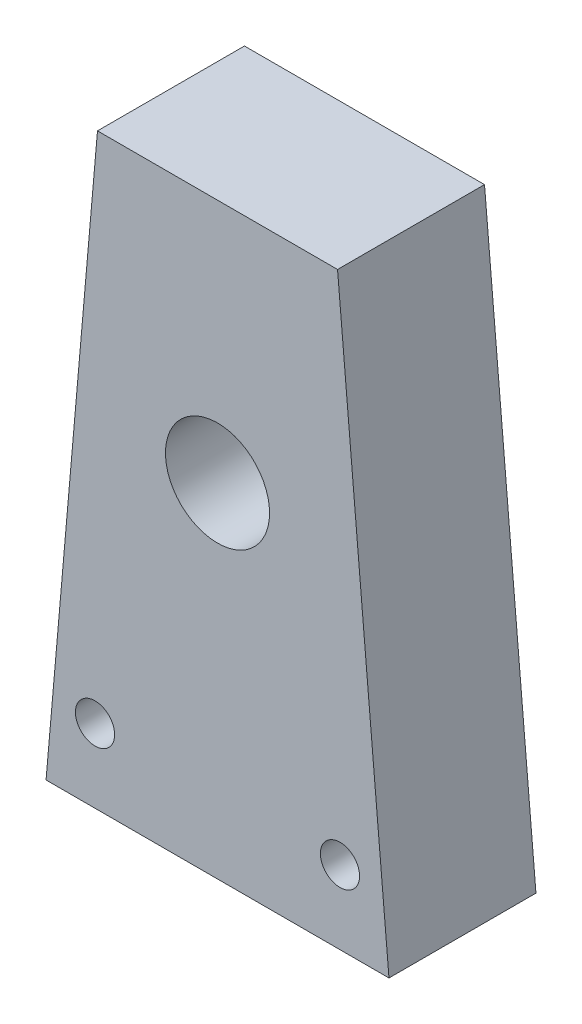
ISO-10303-21;
HEADER;
FILE_DESCRIPTION(('STEP AP214'),'2;1');
FILE_NAME('part.step','',(''),(''),'','','');
FILE_SCHEMA(('AUTOMOTIVE_DESIGN { 1 0 10303 214 1 1 1 1 }'));
ENDSEC;
DATA;
#1=APPLICATION_CONTEXT('core data for automotive mechanical design processes');
#2=APPLICATION_PROTOCOL_DEFINITION('international standard','automotive_design',2000,#1);
#3=PRODUCT_CONTEXT('',#1,'mechanical');
#4=PRODUCT('Part','Part','',(#3));
#5=PRODUCT_RELATED_PRODUCT_CATEGORY('part','',(#4));
#6=PRODUCT_DEFINITION_FORMATION('','',#4);
#7=PRODUCT_DEFINITION_CONTEXT('part definition',#1,'design');
#8=PRODUCT_DEFINITION('design','',#6,#7);
#9=PRODUCT_DEFINITION_SHAPE('','',#8);
#10=(LENGTH_UNIT() NAMED_UNIT(*) SI_UNIT(.MILLI.,.METRE.));
#11=(NAMED_UNIT(*) PLANE_ANGLE_UNIT() SI_UNIT($,.RADIAN.));
#12=(NAMED_UNIT(*) SI_UNIT($,.STERADIAN.) SOLID_ANGLE_UNIT());
#13=UNCERTAINTY_MEASURE_WITH_UNIT(LENGTH_MEASURE(1.E-05),#10,'distance_accuracy_value','');
#14=(GEOMETRIC_REPRESENTATION_CONTEXT(3) GLOBAL_UNCERTAINTY_ASSIGNED_CONTEXT((#13)) GLOBAL_UNIT_ASSIGNED_CONTEXT((#10,
#11,#12)) REPRESENTATION_CONTEXT('',''));
#15=CARTESIAN_POINT('',(0.,0.,0.));
#16=DIRECTION('',(0.,0.,1.));
#17=DIRECTION('',(1.,0.,0.));
#18=AXIS2_PLACEMENT_3D('',#15,#16,#17);
#19=CARTESIAN_POINT('',(-9.8,48.,12.));
#20=DIRECTION('',(0.996193717496113,-0.0871669502809099,0.));
#21=DIRECTION('',(0.0871669502809099,0.996193717496113,0.));
#22=AXIS2_PLACEMENT_3D('',#19,#20,#21);
#23=PLANE('',#22);
#24=DIRECTION('',(-0.0871669502809099,-0.996193717496113,0.));
#25=VECTOR('',#24,1.);
#26=CARTESIAN_POINT('',(-9.8,48.,0.));
#27=LINE('',#26,#25);
#28=CARTESIAN_POINT('',(-9.8,48.,0.));
#29=VERTEX_POINT('',#28);
#30=CARTESIAN_POINT('',(-14.,0.,0.));
#31=VERTEX_POINT('',#30);
#32=EDGE_CURVE('E114',#29,#31,#27,.T.);
#33=ORIENTED_EDGE('',*,*,#32,.T.);
#34=DIRECTION('',(0.,0.,-1.));
#35=VECTOR('',#34,1.);
#36=CARTESIAN_POINT('',(-14.,0.,12.));
#37=LINE('',#36,#35);
#38=CARTESIAN_POINT('',(-14.,0.,12.));
#39=VERTEX_POINT('',#38);
#40=EDGE_CURVE('E11',#39,#31,#37,.T.);
#41=ORIENTED_EDGE('',*,*,#40,.F.);
#42=DIRECTION('',(-0.0871669502809099,-0.996193717496113,0.));
#43=VECTOR('',#42,1.);
#44=CARTESIAN_POINT('',(-9.8,48.,12.));
#45=LINE('',#44,#43);
#46=CARTESIAN_POINT('',(-9.8,48.,12.));
#47=VERTEX_POINT('',#46);
#48=EDGE_CURVE('E100',#47,#39,#45,.T.);
#49=ORIENTED_EDGE('',*,*,#48,.F.);
#50=DIRECTION('',(0.,0.,-1.));
#51=VECTOR('',#50,1.);
#52=CARTESIAN_POINT('',(-9.8,48.,12.));
#53=LINE('',#52,#51);
#54=EDGE_CURVE('E108',#47,#29,#53,.T.);
#55=ORIENTED_EDGE('',*,*,#54,.T.);
#56=EDGE_LOOP('',(#33,#41,#49,#55));
#57=FACE_BOUND('',#56,.T.);
#58=ADVANCED_FACE('F44',(#57),#23,.F.);
#59=CARTESIAN_POINT('',(-14.,0.,12.));
#60=DIRECTION('',(0.,1.,0.));
#61=DIRECTION('',(0.,0.,1.));
#62=AXIS2_PLACEMENT_3D('',#59,#60,#61);
#63=PLANE('',#62);
#64=DIRECTION('',(1.,0.,0.));
#65=VECTOR('',#64,1.);
#66=CARTESIAN_POINT('',(-14.,0.,0.));
#67=LINE('',#66,#65);
#68=CARTESIAN_POINT('',(14.,0.,0.));
#69=VERTEX_POINT('',#68);
#70=EDGE_CURVE('E105',#31,#69,#67,.T.);
#71=ORIENTED_EDGE('',*,*,#70,.T.);
#72=DIRECTION('',(0.,0.,-1.));
#73=VECTOR('',#72,1.);
#74=CARTESIAN_POINT('',(14.,0.,12.));
#75=LINE('',#74,#73);
#76=CARTESIAN_POINT('',(14.,0.,12.));
#77=VERTEX_POINT('',#76);
#78=EDGE_CURVE('E53',#77,#69,#75,.T.);
#79=ORIENTED_EDGE('',*,*,#78,.F.);
#80=DIRECTION('',(1.,0.,0.));
#81=VECTOR('',#80,1.);
#82=CARTESIAN_POINT('',(-14.,0.,12.));
#83=LINE('',#82,#81);
#84=EDGE_CURVE('E95',#39,#77,#83,.T.);
#85=ORIENTED_EDGE('',*,*,#84,.F.);
#86=ORIENTED_EDGE('',*,*,#40,.T.);
#87=EDGE_LOOP('',(#71,#79,#85,#86));
#88=FACE_BOUND('',#87,.T.);
#89=ADVANCED_FACE('F101',(#88),#63,.F.);
#90=CARTESIAN_POINT('',(14.,0.,12.));
#91=DIRECTION('',(-0.996193717496113,-0.0871669502809099,0.));
#92=DIRECTION('',(0.0871669502809099,-0.996193717496113,0.));
#93=AXIS2_PLACEMENT_3D('',#90,#91,#92);
#94=PLANE('',#93);
#95=DIRECTION('',(-0.0871669502809099,0.996193717496113,0.));
#96=VECTOR('',#95,1.);
#97=CARTESIAN_POINT('',(14.,0.,0.));
#98=LINE('',#97,#96);
#99=CARTESIAN_POINT('',(9.8,48.,0.));
#100=VERTEX_POINT('',#99);
#101=EDGE_CURVE('E76',#69,#100,#98,.T.);
#102=ORIENTED_EDGE('',*,*,#101,.T.);
#103=DIRECTION('',(0.,0.,-1.));
#104=VECTOR('',#103,1.);
#105=CARTESIAN_POINT('',(9.8,48.,12.));
#106=LINE('',#105,#104);
#107=CARTESIAN_POINT('',(9.8,48.,12.));
#108=VERTEX_POINT('',#107);
#109=EDGE_CURVE('E102',#108,#100,#106,.T.);
#110=ORIENTED_EDGE('',*,*,#109,.F.);
#111=DIRECTION('',(-0.0871669502809099,0.996193717496113,0.));
#112=VECTOR('',#111,1.);
#113=CARTESIAN_POINT('',(14.,0.,12.));
#114=LINE('',#113,#112);
#115=EDGE_CURVE('E92',#77,#108,#114,.T.);
#116=ORIENTED_EDGE('',*,*,#115,.F.);
#117=ORIENTED_EDGE('',*,*,#78,.T.);
#118=EDGE_LOOP('',(#102,#110,#116,#117));
#119=FACE_BOUND('',#118,.T.);
#120=ADVANCED_FACE('F104',(#119),#94,.F.);
#121=CARTESIAN_POINT('',(9.8,48.,12.));
#122=DIRECTION('',(0.,-1.,0.));
#123=DIRECTION('',(0.,0.,-1.));
#124=AXIS2_PLACEMENT_3D('',#121,#122,#123);
#125=PLANE('',#124);
#126=DIRECTION('',(-1.,0.,0.));
#127=VECTOR('',#126,1.);
#128=CARTESIAN_POINT('',(9.8,48.,0.));
#129=LINE('',#128,#127);
#130=EDGE_CURVE('E82',#100,#29,#129,.T.);
#131=ORIENTED_EDGE('',*,*,#130,.T.);
#132=ORIENTED_EDGE('',*,*,#54,.F.);
#133=DIRECTION('',(-1.,0.,0.));
#134=VECTOR('',#133,1.);
#135=CARTESIAN_POINT('',(9.8,48.,12.));
#136=LINE('',#135,#134);
#137=EDGE_CURVE('E65',#108,#47,#136,.T.);
#138=ORIENTED_EDGE('',*,*,#137,.F.);
#139=ORIENTED_EDGE('',*,*,#109,.T.);
#140=EDGE_LOOP('',(#131,#132,#138,#139));
#141=FACE_BOUND('',#140,.T.);
#142=ADVANCED_FACE('F130',(#141),#125,.F.);
#143=CARTESIAN_POINT('',(0.,0.,12.));
#144=DIRECTION('',(0.,0.,1.));
#145=DIRECTION('',(1.,0.,0.));
#146=AXIS2_PLACEMENT_3D('',#143,#144,#145);
#147=PLANE('',#146);
#148=CARTESIAN_POINT('',(0.,28.,12.));
#149=DIRECTION('',(0.,0.,1.));
#150=DIRECTION('',(1.,0.,0.));
#151=AXIS2_PLACEMENT_3D('',#148,#149,#150);
#152=CIRCLE('',#151,4.25);
#153=CARTESIAN_POINT('',(4.25,28.,12.));
#154=VERTEX_POINT('',#153);
#155=EDGE_CURVE('E120',#154,#154,#152,.F.);
#156=ORIENTED_EDGE('',*,*,#155,.T.);
#157=EDGE_LOOP('',(#156));
#158=FACE_BOUND('',#157,.T.);
#159=CARTESIAN_POINT('',(10.,6.,12.));
#160=DIRECTION('',(0.,0.,1.));
#161=DIRECTION('',(1.,0.,0.));
#162=AXIS2_PLACEMENT_3D('',#159,#160,#161);
#163=CIRCLE('',#162,1.6);
#164=CARTESIAN_POINT('',(11.6,6.,12.));
#165=VERTEX_POINT('',#164);
#166=EDGE_CURVE('E136',#165,#165,#163,.F.);
#167=ORIENTED_EDGE('',*,*,#166,.T.);
#168=EDGE_LOOP('',(#167));
#169=FACE_BOUND('',#168,.T.);
#170=CARTESIAN_POINT('',(-10.,6.,12.));
#171=DIRECTION('',(0.,0.,1.));
#172=DIRECTION('',(1.,0.,0.));
#173=AXIS2_PLACEMENT_3D('',#170,#171,#172);
#174=CIRCLE('',#173,1.6);
#175=CARTESIAN_POINT('',(-8.4,6.,12.));
#176=VERTEX_POINT('',#175);
#177=EDGE_CURVE('E143',#176,#176,#174,.F.);
#178=ORIENTED_EDGE('',*,*,#177,.T.);
#179=EDGE_LOOP('',(#178));
#180=FACE_BOUND('',#179,.T.);
#181=ORIENTED_EDGE('',*,*,#48,.T.);
#182=ORIENTED_EDGE('',*,*,#84,.T.);
#183=ORIENTED_EDGE('',*,*,#115,.T.);
#184=ORIENTED_EDGE('',*,*,#137,.T.);
#185=EDGE_LOOP('',(#181,#182,#183,#184));
#186=FACE_BOUND('',#185,.T.);
#187=ADVANCED_FACE('F91',(#158,#169,#180,#186),#147,.T.);
#188=CARTESIAN_POINT('',(0.,0.,0.));
#189=DIRECTION('',(0.,0.,1.));
#190=DIRECTION('',(1.,0.,0.));
#191=AXIS2_PLACEMENT_3D('',#188,#189,#190);
#192=PLANE('',#191);
#193=CARTESIAN_POINT('',(0.,28.,0.));
#194=DIRECTION('',(0.,0.,1.));
#195=DIRECTION('',(1.,0.,0.));
#196=AXIS2_PLACEMENT_3D('',#193,#194,#195);
#197=CIRCLE('',#196,4.25);
#198=CARTESIAN_POINT('',(4.25,28.,0.));
#199=VERTEX_POINT('',#198);
#200=EDGE_CURVE('E144',#199,#199,#197,.T.);
#201=ORIENTED_EDGE('',*,*,#200,.T.);
#202=EDGE_LOOP('',(#201));
#203=FACE_BOUND('',#202,.T.);
#204=CARTESIAN_POINT('',(10.,6.,0.));
#205=DIRECTION('',(0.,0.,1.));
#206=DIRECTION('',(1.,0.,0.));
#207=AXIS2_PLACEMENT_3D('',#204,#205,#206);
#208=CIRCLE('',#207,1.6);
#209=CARTESIAN_POINT('',(11.6,6.,0.));
#210=VERTEX_POINT('',#209);
#211=EDGE_CURVE('E147',#210,#210,#208,.T.);
#212=ORIENTED_EDGE('',*,*,#211,.T.);
#213=EDGE_LOOP('',(#212));
#214=FACE_BOUND('',#213,.T.);
#215=CARTESIAN_POINT('',(-10.,6.,0.));
#216=DIRECTION('',(0.,0.,1.));
#217=DIRECTION('',(1.,0.,0.));
#218=AXIS2_PLACEMENT_3D('',#215,#216,#217);
#219=CIRCLE('',#218,1.6);
#220=CARTESIAN_POINT('',(-8.4,6.,0.));
#221=VERTEX_POINT('',#220);
#222=EDGE_CURVE('E148',#221,#221,#219,.T.);
#223=ORIENTED_EDGE('',*,*,#222,.T.);
#224=EDGE_LOOP('',(#223));
#225=FACE_BOUND('',#224,.T.);
#226=ORIENTED_EDGE('',*,*,#32,.F.);
#227=ORIENTED_EDGE('',*,*,#130,.F.);
#228=ORIENTED_EDGE('',*,*,#101,.F.);
#229=ORIENTED_EDGE('',*,*,#70,.F.);
#230=EDGE_LOOP('',(#226,#227,#228,#229));
#231=FACE_BOUND('',#230,.T.);
#232=ADVANCED_FACE('F128',(#203,#214,#225,#231),#192,.F.);
#233=CARTESIAN_POINT('',(-10.,6.,13.));
#234=DIRECTION('',(0.,0.,-1.));
#235=DIRECTION('',(-1.,0.,0.));
#236=AXIS2_PLACEMENT_3D('',#233,#234,#235);
#237=CYLINDRICAL_SURFACE('',#236,1.6);
#238=ORIENTED_EDGE('',*,*,#177,.F.);
#239=EDGE_LOOP('',(#238));
#240=FACE_BOUND('',#239,.T.);
#241=ORIENTED_EDGE('',*,*,#222,.F.);
#242=EDGE_LOOP('',(#241));
#243=FACE_BOUND('',#242,.T.);
#244=ADVANCED_FACE('F169',(#240,#243),#237,.F.);
#245=CARTESIAN_POINT('',(10.,6.,13.));
#246=DIRECTION('',(0.,0.,-1.));
#247=DIRECTION('',(-1.,0.,0.));
#248=AXIS2_PLACEMENT_3D('',#245,#246,#247);
#249=CYLINDRICAL_SURFACE('',#248,1.6);
#250=ORIENTED_EDGE('',*,*,#166,.F.);
#251=EDGE_LOOP('',(#250));
#252=FACE_BOUND('',#251,.T.);
#253=ORIENTED_EDGE('',*,*,#211,.F.);
#254=EDGE_LOOP('',(#253));
#255=FACE_BOUND('',#254,.T.);
#256=ADVANCED_FACE('F165',(#252,#255),#249,.F.);
#257=CARTESIAN_POINT('',(0.,28.,13.));
#258=DIRECTION('',(0.,0.,-1.));
#259=DIRECTION('',(-1.,0.,0.));
#260=AXIS2_PLACEMENT_3D('',#257,#258,#259);
#261=CYLINDRICAL_SURFACE('',#260,4.25);
#262=ORIENTED_EDGE('',*,*,#155,.F.);
#263=EDGE_LOOP('',(#262));
#264=FACE_BOUND('',#263,.T.);
#265=ORIENTED_EDGE('',*,*,#200,.F.);
#266=EDGE_LOOP('',(#265));
#267=FACE_BOUND('',#266,.T.);
#268=ADVANCED_FACE('F159',(#264,#267),#261,.F.);
#269=CLOSED_SHELL('',(#58,#89,#120,#142,#187,#232,#244,#256,#268));
#270=MANIFOLD_SOLID_BREP('B2',#269);
#271=ADVANCED_BREP_SHAPE_REPRESENTATION('',(#18,#270),#14);
#272=SHAPE_DEFINITION_REPRESENTATION(#9,#271);
ENDSEC;
END-ISO-10303-21;
